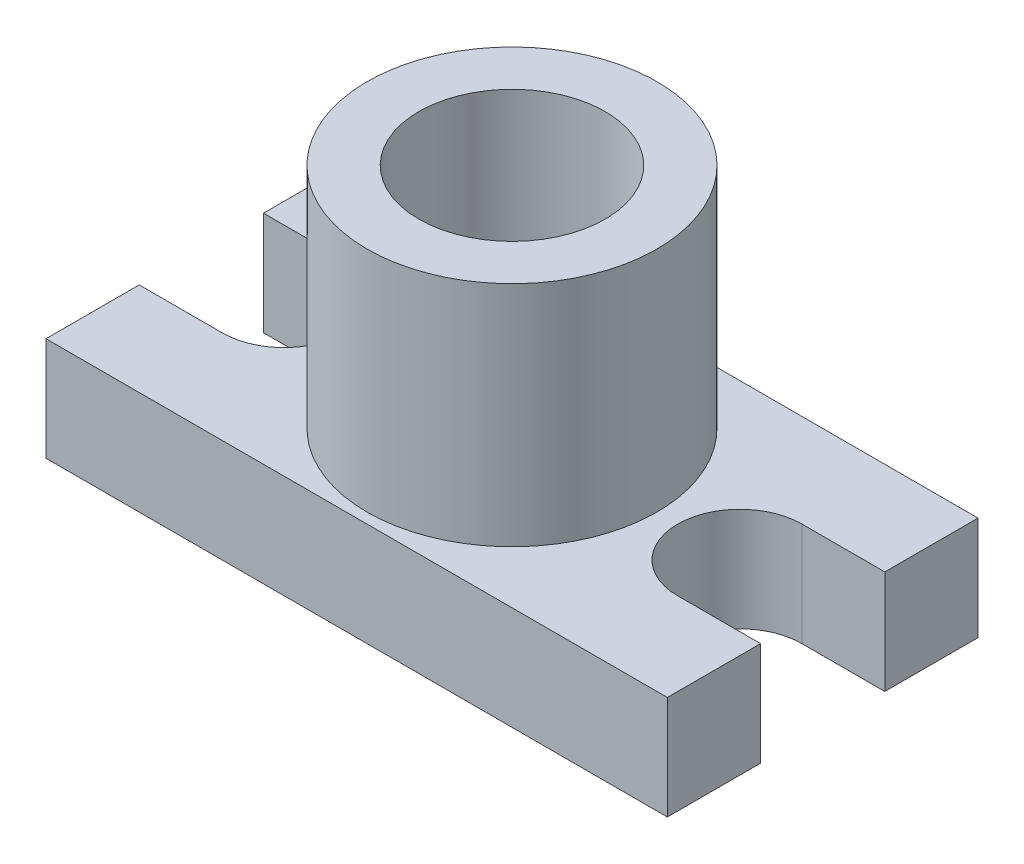
ISO-10303-21;
HEADER;
FILE_DESCRIPTION(('STEP AP214'),'2;1');
FILE_NAME('part.step','',(''),(''),'','','');
FILE_SCHEMA(('AUTOMOTIVE_DESIGN { 1 0 10303 214 1 1 1 1 }'));
ENDSEC;
DATA;
#1=APPLICATION_CONTEXT('core data for automotive mechanical design processes');
#2=APPLICATION_PROTOCOL_DEFINITION('international standard','automotive_design',2000,#1);
#3=PRODUCT_CONTEXT('',#1,'mechanical');
#4=PRODUCT('Part','Part','',(#3));
#5=PRODUCT_RELATED_PRODUCT_CATEGORY('part','',(#4));
#6=PRODUCT_DEFINITION_FORMATION('','',#4);
#7=PRODUCT_DEFINITION_CONTEXT('part definition',#1,'design');
#8=PRODUCT_DEFINITION('design','',#6,#7);
#9=PRODUCT_DEFINITION_SHAPE('','',#8);
#10=(LENGTH_UNIT() NAMED_UNIT(*) SI_UNIT(.MILLI.,.METRE.));
#11=(NAMED_UNIT(*) PLANE_ANGLE_UNIT() SI_UNIT($,.RADIAN.));
#12=(NAMED_UNIT(*) SI_UNIT($,.STERADIAN.) SOLID_ANGLE_UNIT());
#13=UNCERTAINTY_MEASURE_WITH_UNIT(LENGTH_MEASURE(1.E-05),#10,'distance_accuracy_value','');
#14=(GEOMETRIC_REPRESENTATION_CONTEXT(3) GLOBAL_UNCERTAINTY_ASSIGNED_CONTEXT((#13)) GLOBAL_UNIT_ASSIGNED_CONTEXT((#10,
#11,#12)) REPRESENTATION_CONTEXT('',''));
#15=CARTESIAN_POINT('',(0.,0.,0.));
#16=DIRECTION('',(0.,0.,1.));
#17=DIRECTION('',(1.,0.,0.));
#18=AXIS2_PLACEMENT_3D('',#15,#16,#17);
#19=CARTESIAN_POINT('',(15.,5.,-3.));
#20=DIRECTION('',(-1.,0.,0.));
#21=DIRECTION('',(0.,0.,1.));
#22=AXIS2_PLACEMENT_3D('',#19,#20,#21);
#23=PLANE('',#22);
#24=DIRECTION('',(0.,0.,-1.));
#25=VECTOR('',#24,1.);
#26=CARTESIAN_POINT('',(15.,0.,-3.));
#27=LINE('',#26,#25);
#28=CARTESIAN_POINT('',(15.,0.,-3.));
#29=VERTEX_POINT('',#28);
#30=CARTESIAN_POINT('',(15.,0.,-7.5));
#31=VERTEX_POINT('',#30);
#32=EDGE_CURVE('E172',#29,#31,#27,.T.);
#33=ORIENTED_EDGE('',*,*,#32,.T.);
#34=DIRECTION('',(0.,-1.,0.));
#35=VECTOR('',#34,1.);
#36=CARTESIAN_POINT('',(15.,5.,-7.5));
#37=LINE('',#36,#35);
#38=CARTESIAN_POINT('',(15.,5.,-7.5));
#39=VERTEX_POINT('',#38);
#40=EDGE_CURVE('E48',#39,#31,#37,.T.);
#41=ORIENTED_EDGE('',*,*,#40,.F.);
#42=DIRECTION('',(0.,0.,-1.));
#43=VECTOR('',#42,1.);
#44=CARTESIAN_POINT('',(15.,5.,-3.));
#45=LINE('',#44,#43);
#46=CARTESIAN_POINT('',(15.,5.,-3.));
#47=VERTEX_POINT('',#46);
#48=EDGE_CURVE('E207',#47,#39,#45,.T.);
#49=ORIENTED_EDGE('',*,*,#48,.F.);
#50=DIRECTION('',(0.,-1.,0.));
#51=VECTOR('',#50,1.);
#52=CARTESIAN_POINT('',(15.,5.,-3.));
#53=LINE('',#52,#51);
#54=EDGE_CURVE('E168',#47,#29,#53,.T.);
#55=ORIENTED_EDGE('',*,*,#54,.T.);
#56=EDGE_LOOP('',(#33,#41,#49,#55));
#57=FACE_BOUND('',#56,.T.);
#58=ADVANCED_FACE('F45',(#57),#23,.F.);
#59=CARTESIAN_POINT('',(-15.,5.,-7.5));
#60=DIRECTION('',(0.,0.,1.));
#61=DIRECTION('',(1.,0.,0.));
#62=AXIS2_PLACEMENT_3D('',#59,#60,#61);
#63=PLANE('',#62);
#64=DIRECTION('',(-1.,0.,0.));
#65=VECTOR('',#64,1.);
#66=CARTESIAN_POINT('',(-15.,0.,-7.5));
#67=LINE('',#66,#65);
#68=CARTESIAN_POINT('',(-15.,0.,-7.5));
#69=VERTEX_POINT('',#68);
#70=EDGE_CURVE('E176',#31,#69,#67,.T.);
#71=ORIENTED_EDGE('',*,*,#70,.T.);
#72=DIRECTION('',(0.,-1.,0.));
#73=VECTOR('',#72,1.);
#74=CARTESIAN_POINT('',(-15.,5.,-7.5));
#75=LINE('',#74,#73);
#76=CARTESIAN_POINT('',(-15.,5.,-7.5));
#77=VERTEX_POINT('',#76);
#78=EDGE_CURVE('E237',#77,#69,#75,.T.);
#79=ORIENTED_EDGE('',*,*,#78,.F.);
#80=DIRECTION('',(-1.,0.,0.));
#81=VECTOR('',#80,1.);
#82=CARTESIAN_POINT('',(-15.,5.,-7.5));
#83=LINE('',#82,#81);
#84=EDGE_CURVE('E119',#39,#77,#83,.T.);
#85=ORIENTED_EDGE('',*,*,#84,.F.);
#86=ORIENTED_EDGE('',*,*,#40,.T.);
#87=EDGE_LOOP('',(#71,#79,#85,#86));
#88=FACE_BOUND('',#87,.T.);
#89=ADVANCED_FACE('F245',(#88),#63,.F.);
#90=CARTESIAN_POINT('',(-15.,5.,-3.));
#91=DIRECTION('',(1.,0.,0.));
#92=DIRECTION('',(0.,0.,-1.));
#93=AXIS2_PLACEMENT_3D('',#90,#91,#92);
#94=PLANE('',#93);
#95=DIRECTION('',(0.,0.,1.));
#96=VECTOR('',#95,1.);
#97=CARTESIAN_POINT('',(-15.,0.,-3.));
#98=LINE('',#97,#96);
#99=CARTESIAN_POINT('',(-15.,0.,-3.));
#100=VERTEX_POINT('',#99);
#101=EDGE_CURVE('E180',#69,#100,#98,.T.);
#102=ORIENTED_EDGE('',*,*,#101,.T.);
#103=DIRECTION('',(0.,-1.,0.));
#104=VECTOR('',#103,1.);
#105=CARTESIAN_POINT('',(-15.,5.,-3.));
#106=LINE('',#105,#104);
#107=CARTESIAN_POINT('',(-15.,5.,-3.));
#108=VERTEX_POINT('',#107);
#109=EDGE_CURVE('E234',#108,#100,#106,.T.);
#110=ORIENTED_EDGE('',*,*,#109,.F.);
#111=DIRECTION('',(0.,0.,1.));
#112=VECTOR('',#111,1.);
#113=CARTESIAN_POINT('',(-15.,5.,-3.));
#114=LINE('',#113,#112);
#115=EDGE_CURVE('E263',#77,#108,#114,.T.);
#116=ORIENTED_EDGE('',*,*,#115,.F.);
#117=ORIENTED_EDGE('',*,*,#78,.T.);
#118=EDGE_LOOP('',(#102,#110,#116,#117));
#119=FACE_BOUND('',#118,.T.);
#120=ADVANCED_FACE('F254',(#119),#94,.F.);
#121=CARTESIAN_POINT('',(-11.,5.,-3.));
#122=DIRECTION('',(0.,0.,-1.));
#123=DIRECTION('',(-1.,0.,0.));
#124=AXIS2_PLACEMENT_3D('',#121,#122,#123);
#125=PLANE('',#124);
#126=DIRECTION('',(1.,0.,0.));
#127=VECTOR('',#126,1.);
#128=CARTESIAN_POINT('',(-11.,0.,-3.));
#129=LINE('',#128,#127);
#130=CARTESIAN_POINT('',(-11.,0.,-3.));
#131=VERTEX_POINT('',#130);
#132=EDGE_CURVE('E183',#100,#131,#129,.T.);
#133=ORIENTED_EDGE('',*,*,#132,.T.);
#134=DIRECTION('',(0.,-1.,0.));
#135=VECTOR('',#134,1.);
#136=CARTESIAN_POINT('',(-11.,5.,-3.));
#137=LINE('',#136,#135);
#138=CARTESIAN_POINT('',(-11.,5.,-3.));
#139=VERTEX_POINT('',#138);
#140=EDGE_CURVE('E230',#139,#131,#137,.T.);
#141=ORIENTED_EDGE('',*,*,#140,.F.);
#142=DIRECTION('',(1.,0.,0.));
#143=VECTOR('',#142,1.);
#144=CARTESIAN_POINT('',(-11.,5.,-3.));
#145=LINE('',#144,#143);
#146=EDGE_CURVE('E259',#108,#139,#145,.T.);
#147=ORIENTED_EDGE('',*,*,#146,.F.);
#148=ORIENTED_EDGE('',*,*,#109,.T.);
#149=EDGE_LOOP('',(#133,#141,#147,#148));
#150=FACE_BOUND('',#149,.T.);
#151=ADVANCED_FACE('F257',(#150),#125,.F.);
#152=CARTESIAN_POINT('',(-11.,5.,0.));
#153=DIRECTION('',(0.,-1.,0.));
#154=DIRECTION('',(0.,0.,-1.));
#155=AXIS2_PLACEMENT_3D('',#152,#153,#154);
#156=CYLINDRICAL_SURFACE('',#155,3.);
#157=CARTESIAN_POINT('',(-11.,0.,0.));
#158=DIRECTION('',(0.,-1.,0.));
#159=DIRECTION('',(0.,0.,1.));
#160=AXIS2_PLACEMENT_3D('',#157,#158,#159);
#161=CIRCLE('',#160,3.);
#162=CARTESIAN_POINT('',(-11.,0.,3.));
#163=VERTEX_POINT('',#162);
#164=EDGE_CURVE('E186',#131,#163,#161,.T.);
#165=ORIENTED_EDGE('',*,*,#164,.T.);
#166=DIRECTION('',(0.,-1.,0.));
#167=VECTOR('',#166,1.);
#168=CARTESIAN_POINT('',(-11.,5.,3.));
#169=LINE('',#168,#167);
#170=CARTESIAN_POINT('',(-11.,5.,3.));
#171=VERTEX_POINT('',#170);
#172=EDGE_CURVE('E226',#171,#163,#169,.T.);
#173=ORIENTED_EDGE('',*,*,#172,.F.);
#174=CARTESIAN_POINT('',(-11.,5.,0.));
#175=DIRECTION('',(0.,-1.,0.));
#176=DIRECTION('',(0.,0.,1.));
#177=AXIS2_PLACEMENT_3D('',#174,#175,#176);
#178=CIRCLE('',#177,3.);
#179=EDGE_CURVE('E262',#139,#171,#178,.T.);
#180=ORIENTED_EDGE('',*,*,#179,.F.);
#181=ORIENTED_EDGE('',*,*,#140,.T.);
#182=EDGE_LOOP('',(#165,#173,#180,#181));
#183=FACE_BOUND('',#182,.T.);
#184=ADVANCED_FACE('F300',(#183),#156,.F.);
#185=CARTESIAN_POINT('',(-11.,5.,3.));
#186=DIRECTION('',(0.,0.,1.));
#187=DIRECTION('',(1.,0.,0.));
#188=AXIS2_PLACEMENT_3D('',#185,#186,#187);
#189=PLANE('',#188);
#190=DIRECTION('',(-1.,0.,0.));
#191=VECTOR('',#190,1.);
#192=CARTESIAN_POINT('',(-11.,0.,3.));
#193=LINE('',#192,#191);
#194=CARTESIAN_POINT('',(-15.,0.,3.));
#195=VERTEX_POINT('',#194);
#196=EDGE_CURVE('E189',#163,#195,#193,.T.);
#197=ORIENTED_EDGE('',*,*,#196,.T.);
#198=DIRECTION('',(0.,-1.,0.));
#199=VECTOR('',#198,1.);
#200=CARTESIAN_POINT('',(-15.,5.,3.));
#201=LINE('',#200,#199);
#202=CARTESIAN_POINT('',(-15.,5.,3.));
#203=VERTEX_POINT('',#202);
#204=EDGE_CURVE('E222',#203,#195,#201,.T.);
#205=ORIENTED_EDGE('',*,*,#204,.F.);
#206=DIRECTION('',(-1.,0.,0.));
#207=VECTOR('',#206,1.);
#208=CARTESIAN_POINT('',(-11.,5.,3.));
#209=LINE('',#208,#207);
#210=EDGE_CURVE('E267',#171,#203,#209,.T.);
#211=ORIENTED_EDGE('',*,*,#210,.F.);
#212=ORIENTED_EDGE('',*,*,#172,.T.);
#213=EDGE_LOOP('',(#197,#205,#211,#212));
#214=FACE_BOUND('',#213,.T.);
#215=ADVANCED_FACE('F297',(#214),#189,.F.);
#216=CARTESIAN_POINT('',(-15.,5.,7.5));
#217=DIRECTION('',(1.,0.,0.));
#218=DIRECTION('',(0.,0.,-1.));
#219=AXIS2_PLACEMENT_3D('',#216,#217,#218);
#220=PLANE('',#219);
#221=DIRECTION('',(0.,0.,1.));
#222=VECTOR('',#221,1.);
#223=CARTESIAN_POINT('',(-15.,0.,7.5));
#224=LINE('',#223,#222);
#225=CARTESIAN_POINT('',(-15.,0.,7.5));
#226=VERTEX_POINT('',#225);
#227=EDGE_CURVE('E192',#195,#226,#224,.T.);
#228=ORIENTED_EDGE('',*,*,#227,.T.);
#229=DIRECTION('',(0.,-1.,0.));
#230=VECTOR('',#229,1.);
#231=CARTESIAN_POINT('',(-15.,5.,7.5));
#232=LINE('',#231,#230);
#233=CARTESIAN_POINT('',(-15.,5.,7.5));
#234=VERTEX_POINT('',#233);
#235=EDGE_CURVE('E218',#234,#226,#232,.T.);
#236=ORIENTED_EDGE('',*,*,#235,.F.);
#237=DIRECTION('',(0.,0.,1.));
#238=VECTOR('',#237,1.);
#239=CARTESIAN_POINT('',(-15.,5.,7.5));
#240=LINE('',#239,#238);
#241=EDGE_CURVE('E274',#203,#234,#240,.T.);
#242=ORIENTED_EDGE('',*,*,#241,.F.);
#243=ORIENTED_EDGE('',*,*,#204,.T.);
#244=EDGE_LOOP('',(#228,#236,#242,#243));
#245=FACE_BOUND('',#244,.T.);
#246=ADVANCED_FACE('F293',(#245),#220,.F.);
#247=CARTESIAN_POINT('',(-15.,5.,7.5));
#248=DIRECTION('',(0.,0.,-1.));
#249=DIRECTION('',(-1.,0.,0.));
#250=AXIS2_PLACEMENT_3D('',#247,#248,#249);
#251=PLANE('',#250);
#252=DIRECTION('',(1.,0.,0.));
#253=VECTOR('',#252,1.);
#254=CARTESIAN_POINT('',(-15.,0.,7.5));
#255=LINE('',#254,#253);
#256=CARTESIAN_POINT('',(15.,0.,7.5));
#257=VERTEX_POINT('',#256);
#258=EDGE_CURVE('E195',#226,#257,#255,.T.);
#259=ORIENTED_EDGE('',*,*,#258,.T.);
#260=DIRECTION('',(0.,-1.,0.));
#261=VECTOR('',#260,1.);
#262=CARTESIAN_POINT('',(15.,5.,7.5));
#263=LINE('',#262,#261);
#264=CARTESIAN_POINT('',(15.,5.,7.5));
#265=VERTEX_POINT('',#264);
#266=EDGE_CURVE('E214',#265,#257,#263,.T.);
#267=ORIENTED_EDGE('',*,*,#266,.F.);
#268=DIRECTION('',(1.,0.,0.));
#269=VECTOR('',#268,1.);
#270=CARTESIAN_POINT('',(-15.,5.,7.5));
#271=LINE('',#270,#269);
#272=EDGE_CURVE('E277',#234,#265,#271,.T.);
#273=ORIENTED_EDGE('',*,*,#272,.F.);
#274=ORIENTED_EDGE('',*,*,#235,.T.);
#275=EDGE_LOOP('',(#259,#267,#273,#274));
#276=FACE_BOUND('',#275,.T.);
#277=ADVANCED_FACE('F285',(#276),#251,.F.);
#278=CARTESIAN_POINT('',(15.,5.,7.5));
#279=DIRECTION('',(-1.,0.,0.));
#280=DIRECTION('',(0.,0.,1.));
#281=AXIS2_PLACEMENT_3D('',#278,#279,#280);
#282=PLANE('',#281);
#283=DIRECTION('',(0.,0.,-1.));
#284=VECTOR('',#283,1.);
#285=CARTESIAN_POINT('',(15.,0.,7.5));
#286=LINE('',#285,#284);
#287=CARTESIAN_POINT('',(15.,0.,3.));
#288=VERTEX_POINT('',#287);
#289=EDGE_CURVE('E198',#257,#288,#286,.T.);
#290=ORIENTED_EDGE('',*,*,#289,.T.);
#291=DIRECTION('',(0.,-1.,0.));
#292=VECTOR('',#291,1.);
#293=CARTESIAN_POINT('',(15.,5.,3.));
#294=LINE('',#293,#292);
#295=CARTESIAN_POINT('',(15.,5.,3.));
#296=VERTEX_POINT('',#295);
#297=EDGE_CURVE('E161',#296,#288,#294,.T.);
#298=ORIENTED_EDGE('',*,*,#297,.F.);
#299=DIRECTION('',(0.,0.,-1.));
#300=VECTOR('',#299,1.);
#301=CARTESIAN_POINT('',(15.,5.,7.5));
#302=LINE('',#301,#300);
#303=EDGE_CURVE('E150',#265,#296,#302,.T.);
#304=ORIENTED_EDGE('',*,*,#303,.F.);
#305=ORIENTED_EDGE('',*,*,#266,.T.);
#306=EDGE_LOOP('',(#290,#298,#304,#305));
#307=FACE_BOUND('',#306,.T.);
#308=ADVANCED_FACE('F289',(#307),#282,.F.);
#309=CARTESIAN_POINT('',(11.,5.,3.));
#310=DIRECTION('',(0.,0.,1.));
#311=DIRECTION('',(1.,0.,0.));
#312=AXIS2_PLACEMENT_3D('',#309,#310,#311);
#313=PLANE('',#312);
#314=DIRECTION('',(-1.,0.,0.));
#315=VECTOR('',#314,1.);
#316=CARTESIAN_POINT('',(11.,0.,3.));
#317=LINE('',#316,#315);
#318=CARTESIAN_POINT('',(11.,0.,3.));
#319=VERTEX_POINT('',#318);
#320=EDGE_CURVE('E159',#288,#319,#317,.T.);
#321=ORIENTED_EDGE('',*,*,#320,.T.);
#322=DIRECTION('',(0.,-1.,0.));
#323=VECTOR('',#322,1.);
#324=CARTESIAN_POINT('',(11.,5.,3.));
#325=LINE('',#324,#323);
#326=CARTESIAN_POINT('',(11.,5.,3.));
#327=VERTEX_POINT('',#326);
#328=EDGE_CURVE('E156',#327,#319,#325,.T.);
#329=ORIENTED_EDGE('',*,*,#328,.F.);
#330=DIRECTION('',(-1.,0.,0.));
#331=VECTOR('',#330,1.);
#332=CARTESIAN_POINT('',(11.,5.,3.));
#333=LINE('',#332,#331);
#334=EDGE_CURVE('E144',#296,#327,#333,.T.);
#335=ORIENTED_EDGE('',*,*,#334,.F.);
#336=ORIENTED_EDGE('',*,*,#297,.T.);
#337=EDGE_LOOP('',(#321,#329,#335,#336));
#338=FACE_BOUND('',#337,.T.);
#339=ADVANCED_FACE('F157',(#338),#313,.F.);
#340=CARTESIAN_POINT('',(11.,5.,0.));
#341=DIRECTION('',(0.,-1.,0.));
#342=DIRECTION('',(0.,0.,-1.));
#343=AXIS2_PLACEMENT_3D('',#340,#341,#342);
#344=CYLINDRICAL_SURFACE('',#343,3.);
#345=CARTESIAN_POINT('',(11.,0.,0.));
#346=DIRECTION('',(0.,-1.,0.));
#347=DIRECTION('',(0.,0.,-1.));
#348=AXIS2_PLACEMENT_3D('',#345,#346,#347);
#349=CIRCLE('',#348,3.);
#350=CARTESIAN_POINT('',(11.,0.,-3.));
#351=VERTEX_POINT('',#350);
#352=EDGE_CURVE('E104',#319,#351,#349,.T.);
#353=ORIENTED_EDGE('',*,*,#352,.T.);
#354=DIRECTION('',(0.,-1.,0.));
#355=VECTOR('',#354,1.);
#356=CARTESIAN_POINT('',(11.,5.,-3.));
#357=LINE('',#356,#355);
#358=CARTESIAN_POINT('',(11.,5.,-3.));
#359=VERTEX_POINT('',#358);
#360=EDGE_CURVE('E162',#359,#351,#357,.T.);
#361=ORIENTED_EDGE('',*,*,#360,.F.);
#362=CARTESIAN_POINT('',(11.,5.,0.));
#363=DIRECTION('',(0.,-1.,0.));
#364=DIRECTION('',(0.,0.,-1.));
#365=AXIS2_PLACEMENT_3D('',#362,#363,#364);
#366=CIRCLE('',#365,3.);
#367=EDGE_CURVE('E148',#327,#359,#366,.T.);
#368=ORIENTED_EDGE('',*,*,#367,.F.);
#369=ORIENTED_EDGE('',*,*,#328,.T.);
#370=EDGE_LOOP('',(#353,#361,#368,#369));
#371=FACE_BOUND('',#370,.T.);
#372=ADVANCED_FACE('F164',(#371),#344,.F.);
#373=CARTESIAN_POINT('',(11.,5.,-3.));
#374=DIRECTION('',(0.,0.,-1.));
#375=DIRECTION('',(-1.,0.,0.));
#376=AXIS2_PLACEMENT_3D('',#373,#374,#375);
#377=PLANE('',#376);
#378=DIRECTION('',(1.,0.,0.));
#379=VECTOR('',#378,1.);
#380=CARTESIAN_POINT('',(11.,0.,-3.));
#381=LINE('',#380,#379);
#382=EDGE_CURVE('E110',#351,#29,#381,.T.);
#383=ORIENTED_EDGE('',*,*,#382,.T.);
#384=ORIENTED_EDGE('',*,*,#54,.F.);
#385=DIRECTION('',(1.,0.,0.));
#386=VECTOR('',#385,1.);
#387=CARTESIAN_POINT('',(11.,5.,-3.));
#388=LINE('',#387,#386);
#389=EDGE_CURVE('E63',#359,#47,#388,.T.);
#390=ORIENTED_EDGE('',*,*,#389,.F.);
#391=ORIENTED_EDGE('',*,*,#360,.T.);
#392=EDGE_LOOP('',(#383,#384,#390,#391));
#393=FACE_BOUND('',#392,.T.);
#394=ADVANCED_FACE('F376',(#393),#377,.F.);
#395=CARTESIAN_POINT('',(-11.,5.,0.));
#396=DIRECTION('',(0.,1.,0.));
#397=DIRECTION('',(0.,0.,1.));
#398=AXIS2_PLACEMENT_3D('',#395,#396,#397);
#399=PLANE('',#398);
#400=CARTESIAN_POINT('',(0.,5.,0.));
#401=DIRECTION('',(0.,1.,0.));
#402=DIRECTION('',(0.,0.,1.));
#403=AXIS2_PLACEMENT_3D('',#400,#401,#402);
#404=CIRCLE('',#403,7.);
#405=CARTESIAN_POINT('',(0.,5.,7.));
#406=VERTEX_POINT('',#405);
#407=EDGE_CURVE('E11',#406,#406,#404,.T.);
#408=ORIENTED_EDGE('',*,*,#407,.F.);
#409=EDGE_LOOP('',(#408));
#410=FACE_BOUND('',#409,.T.);
#411=ORIENTED_EDGE('',*,*,#48,.T.);
#412=ORIENTED_EDGE('',*,*,#84,.T.);
#413=ORIENTED_EDGE('',*,*,#115,.T.);
#414=ORIENTED_EDGE('',*,*,#146,.T.);
#415=ORIENTED_EDGE('',*,*,#179,.T.);
#416=ORIENTED_EDGE('',*,*,#210,.T.);
#417=ORIENTED_EDGE('',*,*,#241,.T.);
#418=ORIENTED_EDGE('',*,*,#272,.T.);
#419=ORIENTED_EDGE('',*,*,#303,.T.);
#420=ORIENTED_EDGE('',*,*,#334,.T.);
#421=ORIENTED_EDGE('',*,*,#367,.T.);
#422=ORIENTED_EDGE('',*,*,#389,.T.);
#423=EDGE_LOOP('',(#411,#412,#413,#414,#415,#416,#417,#418,#419,#420,#421,#422));
#424=FACE_BOUND('',#423,.T.);
#425=ADVANCED_FACE('F146',(#410,#424),#399,.T.);
#426=CARTESIAN_POINT('',(-11.,0.,0.));
#427=DIRECTION('',(0.,1.,0.));
#428=DIRECTION('',(0.,0.,1.));
#429=AXIS2_PLACEMENT_3D('',#426,#427,#428);
#430=PLANE('',#429);
#431=CARTESIAN_POINT('',(0.,0.,0.));
#432=DIRECTION('',(0.,1.,0.));
#433=DIRECTION('',(0.,0.,1.));
#434=AXIS2_PLACEMENT_3D('',#431,#432,#433);
#435=CIRCLE('',#434,4.5);
#436=CARTESIAN_POINT('',(0.,0.,4.5));
#437=VERTEX_POINT('',#436);
#438=EDGE_CURVE('E444',#437,#437,#435,.T.);
#439=ORIENTED_EDGE('',*,*,#438,.T.);
#440=EDGE_LOOP('',(#439));
#441=FACE_BOUND('',#440,.T.);
#442=ORIENTED_EDGE('',*,*,#32,.F.);
#443=ORIENTED_EDGE('',*,*,#382,.F.);
#444=ORIENTED_EDGE('',*,*,#352,.F.);
#445=ORIENTED_EDGE('',*,*,#320,.F.);
#446=ORIENTED_EDGE('',*,*,#289,.F.);
#447=ORIENTED_EDGE('',*,*,#258,.F.);
#448=ORIENTED_EDGE('',*,*,#227,.F.);
#449=ORIENTED_EDGE('',*,*,#196,.F.);
#450=ORIENTED_EDGE('',*,*,#164,.F.);
#451=ORIENTED_EDGE('',*,*,#132,.F.);
#452=ORIENTED_EDGE('',*,*,#101,.F.);
#453=ORIENTED_EDGE('',*,*,#70,.F.);
#454=EDGE_LOOP('',(#442,#443,#444,#445,#446,#447,#448,#449,#450,#451,#452,#453));
#455=FACE_BOUND('',#454,.T.);
#456=ADVANCED_FACE('F250',(#441,#455),#430,.F.);
#457=CARTESIAN_POINT('',(0.,16.,0.));
#458=DIRECTION('',(0.,1.,0.));
#459=DIRECTION('',(0.,0.,1.));
#460=AXIS2_PLACEMENT_3D('',#457,#458,#459);
#461=PLANE('',#460);
#462=CARTESIAN_POINT('',(0.,16.,0.));
#463=DIRECTION('',(0.,1.,0.));
#464=DIRECTION('',(0.,0.,1.));
#465=AXIS2_PLACEMENT_3D('',#462,#463,#464);
#466=CIRCLE('',#465,7.);
#467=CARTESIAN_POINT('',(0.,16.,7.));
#468=VERTEX_POINT('',#467);
#469=EDGE_CURVE('E177',#468,#468,#466,.T.);
#470=ORIENTED_EDGE('',*,*,#469,.T.);
#471=EDGE_LOOP('',(#470));
#472=FACE_BOUND('',#471,.T.);
#473=CARTESIAN_POINT('',(0.,16.,0.));
#474=DIRECTION('',(0.,1.,0.));
#475=DIRECTION('',(0.,0.,1.));
#476=AXIS2_PLACEMENT_3D('',#473,#474,#475);
#477=CIRCLE('',#476,4.5);
#478=CARTESIAN_POINT('',(0.,16.,4.5));
#479=VERTEX_POINT('',#478);
#480=EDGE_CURVE('E441',#479,#479,#477,.T.);
#481=ORIENTED_EDGE('',*,*,#480,.F.);
#482=EDGE_LOOP('',(#481));
#483=FACE_BOUND('',#482,.T.);
#484=ADVANCED_FACE('F403',(#472,#483),#461,.T.);
#485=CARTESIAN_POINT('',(0.,16.,0.));
#486=DIRECTION('',(0.,-1.,0.));
#487=DIRECTION('',(0.,0.,-1.));
#488=AXIS2_PLACEMENT_3D('',#485,#486,#487);
#489=CYLINDRICAL_SURFACE('',#488,7.);
#490=ORIENTED_EDGE('',*,*,#469,.F.);
#491=EDGE_LOOP('',(#490));
#492=FACE_BOUND('',#491,.T.);
#493=ORIENTED_EDGE('',*,*,#407,.T.);
#494=EDGE_LOOP('',(#493));
#495=FACE_BOUND('',#494,.T.);
#496=ADVANCED_FACE('F414',(#492,#495),#489,.T.);
#497=CARTESIAN_POINT('',(0.,16.,0.));
#498=DIRECTION('',(0.,-1.,0.));
#499=DIRECTION('',(0.,0.,-1.));
#500=AXIS2_PLACEMENT_3D('',#497,#498,#499);
#501=CYLINDRICAL_SURFACE('',#500,4.5);
#502=ORIENTED_EDGE('',*,*,#480,.T.);
#503=EDGE_LOOP('',(#502));
#504=FACE_BOUND('',#503,.T.);
#505=ORIENTED_EDGE('',*,*,#438,.F.);
#506=EDGE_LOOP('',(#505));
#507=FACE_BOUND('',#506,.T.);
#508=ADVANCED_FACE('F423',(#504,#507),#501,.F.);
#509=CLOSED_SHELL('',(#58,#89,#120,#151,#184,#215,#246,#277,#308,#339,#372,#394,#425,#456,#484,
#496,#508));
#510=MANIFOLD_SOLID_BREP('B2',#509);
#511=ADVANCED_BREP_SHAPE_REPRESENTATION('',(#18,#510),#14);
#512=SHAPE_DEFINITION_REPRESENTATION(#9,#511);
ENDSEC;
END-ISO-10303-21;
